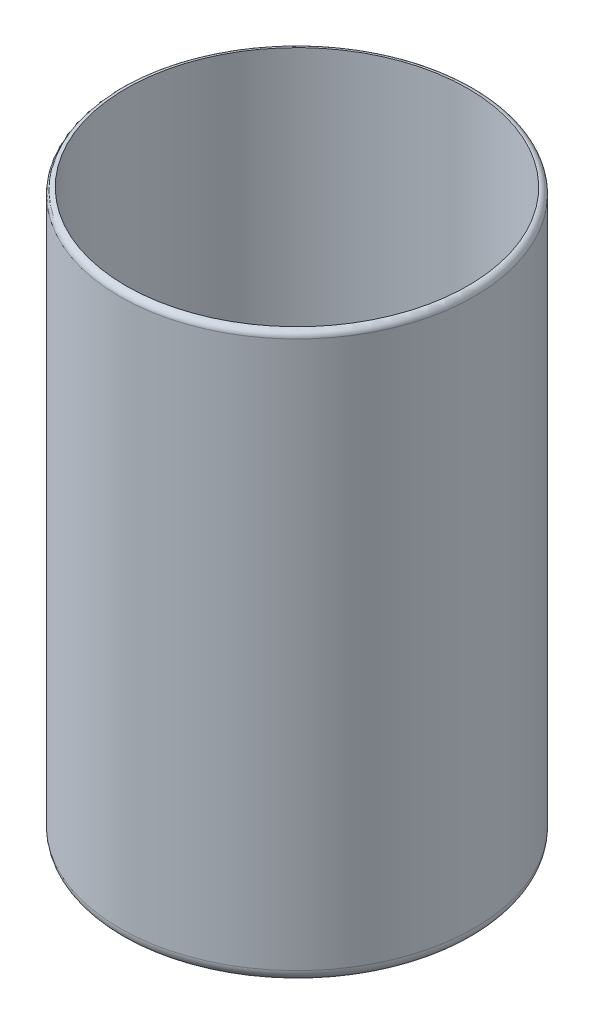
ISO-10303-21;
HEADER;
FILE_DESCRIPTION(('STEP AP214'),'2;1');
FILE_NAME('part.step','',(''),(''),'','','');
FILE_SCHEMA(('AUTOMOTIVE_DESIGN { 1 0 10303 214 1 1 1 1 }'));
ENDSEC;
DATA;
#1=APPLICATION_CONTEXT('core data for automotive mechanical design processes');
#2=APPLICATION_PROTOCOL_DEFINITION('international standard','automotive_design',2000,#1);
#3=PRODUCT_CONTEXT('',#1,'mechanical');
#4=PRODUCT('Part','Part','',(#3));
#5=PRODUCT_RELATED_PRODUCT_CATEGORY('part','',(#4));
#6=PRODUCT_DEFINITION_FORMATION('','',#4);
#7=PRODUCT_DEFINITION_CONTEXT('part definition',#1,'design');
#8=PRODUCT_DEFINITION('design','',#6,#7);
#9=PRODUCT_DEFINITION_SHAPE('','',#8);
#10=(LENGTH_UNIT() NAMED_UNIT(*) SI_UNIT(.MILLI.,.METRE.));
#11=(NAMED_UNIT(*) PLANE_ANGLE_UNIT() SI_UNIT($,.RADIAN.));
#12=(NAMED_UNIT(*) SI_UNIT($,.STERADIAN.) SOLID_ANGLE_UNIT());
#13=UNCERTAINTY_MEASURE_WITH_UNIT(LENGTH_MEASURE(1.E-05),#10,'distance_accuracy_value','');
#14=(GEOMETRIC_REPRESENTATION_CONTEXT(3) GLOBAL_UNCERTAINTY_ASSIGNED_CONTEXT((#13)) GLOBAL_UNIT_ASSIGNED_CONTEXT((#10,
#11,#12)) REPRESENTATION_CONTEXT('',''));
#15=CARTESIAN_POINT('',(0.,0.,0.));
#16=DIRECTION('',(0.,0.,1.));
#17=DIRECTION('',(1.,0.,0.));
#18=AXIS2_PLACEMENT_3D('',#15,#16,#17);
#19=CARTESIAN_POINT('',(0.,0.5,0.));
#20=DIRECTION('',(0.,-1.,0.));
#21=DIRECTION('',(0.,0.,-1.));
#22=AXIS2_PLACEMENT_3D('',#19,#20,#21);
#23=CYLINDRICAL_SURFACE('',#22,14.25);
#24=CARTESIAN_POINT('',(0.,45.,0.));
#25=DIRECTION('',(0.,1.,0.));
#26=DIRECTION('',(0.,0.,1.));
#27=AXIS2_PLACEMENT_3D('',#24,#25,#26);
#28=CIRCLE('',#27,14.25);
#29=CARTESIAN_POINT('',(0.,45.,14.25));
#30=VERTEX_POINT('',#29);
#31=EDGE_CURVE('E10',#30,#30,#28,.F.);
#32=ORIENTED_EDGE('',*,*,#31,.T.);
#33=EDGE_LOOP('',(#32));
#34=FACE_BOUND('',#33,.T.);
#35=CARTESIAN_POINT('',(0.,1.,0.));
#36=DIRECTION('',(0.,1.,0.));
#37=DIRECTION('',(0.,0.,1.));
#38=AXIS2_PLACEMENT_3D('',#35,#36,#37);
#39=CIRCLE('',#38,14.25);
#40=CARTESIAN_POINT('',(0.,1.,14.25));
#41=VERTEX_POINT('',#40);
#42=EDGE_CURVE('E44',#41,#41,#39,.T.);
#43=ORIENTED_EDGE('',*,*,#42,.T.);
#44=EDGE_LOOP('',(#43));
#45=FACE_BOUND('',#44,.T.);
#46=ADVANCED_FACE('F33',(#34,#45),#23,.T.);
#47=CARTESIAN_POINT('',(0.,0.,0.));
#48=DIRECTION('',(0.,1.,0.));
#49=DIRECTION('',(0.,0.,1.));
#50=AXIS2_PLACEMENT_3D('',#47,#48,#49);
#51=PLANE('',#50);
#52=CARTESIAN_POINT('',(0.,0.,0.));
#53=DIRECTION('',(0.,1.,0.));
#54=DIRECTION('',(0.,0.,1.));
#55=AXIS2_PLACEMENT_3D('',#52,#53,#54);
#56=CIRCLE('',#55,13.25);
#57=CARTESIAN_POINT('',(0.,0.,13.25));
#58=VERTEX_POINT('',#57);
#59=EDGE_CURVE('E40',#58,#58,#56,.F.);
#60=ORIENTED_EDGE('',*,*,#59,.T.);
#61=EDGE_LOOP('',(#60));
#62=FACE_BOUND('',#61,.T.);
#63=ADVANCED_FACE('F71',(#62),#51,.F.);
#64=CARTESIAN_POINT('',(0.,45.5,0.));
#65=DIRECTION('',(0.,-1.,0.));
#66=DIRECTION('',(0.,0.,-1.));
#67=AXIS2_PLACEMENT_3D('',#64,#65,#66);
#68=CYLINDRICAL_SURFACE('',#67,13.75);
#69=CARTESIAN_POINT('',(0.,1.5,0.));
#70=DIRECTION('',(0.,1.,0.));
#71=DIRECTION('',(0.,0.,1.));
#72=AXIS2_PLACEMENT_3D('',#69,#70,#71);
#73=CIRCLE('',#72,13.75);
#74=CARTESIAN_POINT('',(0.,1.49999999999999,-13.75));
#75=VERTEX_POINT('',#74);
#76=EDGE_CURVE('E53',#75,#75,#73,.F.);
#77=CARTESIAN_POINT('',(0.,45.5,0.));
#78=DIRECTION('',(0.,1.,0.));
#79=DIRECTION('',(0.,0.,1.));
#80=AXIS2_PLACEMENT_3D('',#77,#78,#79);
#81=CIRCLE('',#80,13.75);
#82=CARTESIAN_POINT('',(0.,45.5,-13.75));
#83=VERTEX_POINT('',#82);
#84=EDGE_CURVE('E56',#83,#83,#81,.T.);
#85=CARTESIAN_POINT('',(0.,1.49999999999999,-13.75));
#86=CARTESIAN_POINT('',(0.,1.95833333333333,-13.75));
#87=CARTESIAN_POINT('',(0.,2.41666666666666,-13.75));
#88=CARTESIAN_POINT('',(0.,3.33333333333333,-13.75));
#89=CARTESIAN_POINT('',(0.,3.79166666666666,-13.75));
#90=CARTESIAN_POINT('',(0.,4.70833333333333,-13.75));
#91=CARTESIAN_POINT('',(0.,5.16666666666666,-13.75));
#92=CARTESIAN_POINT('',(0.,6.08333333333333,-13.75));
#93=CARTESIAN_POINT('',(0.,6.54166666666666,-13.75));
#94=CARTESIAN_POINT('',(0.,7.45833333333333,-13.75));
#95=CARTESIAN_POINT('',(0.,7.91666666666666,-13.75));
#96=CARTESIAN_POINT('',(0.,8.83333333333333,-13.75));
#97=CARTESIAN_POINT('',(0.,9.29166666666666,-13.75));
#98=CARTESIAN_POINT('',(0.,10.2083333333333,-13.75));
#99=CARTESIAN_POINT('',(0.,10.6666666666667,-13.75));
#100=CARTESIAN_POINT('',(0.,11.5833333333333,-13.75));
#101=CARTESIAN_POINT('',(0.,12.0416666666667,-13.75));
#102=CARTESIAN_POINT('',(0.,12.9583333333333,-13.75));
#103=CARTESIAN_POINT('',(0.,13.4166666666667,-13.75));
#104=CARTESIAN_POINT('',(0.,14.3333333333333,-13.75));
#105=CARTESIAN_POINT('',(0.,14.7916666666667,-13.75));
#106=CARTESIAN_POINT('',(0.,15.7083333333333,-13.75));
#107=CARTESIAN_POINT('',(0.,16.1666666666667,-13.75));
#108=CARTESIAN_POINT('',(0.,17.0833333333333,-13.75));
#109=CARTESIAN_POINT('',(0.,17.5416666666667,-13.75));
#110=CARTESIAN_POINT('',(0.,18.4583333333333,-13.75));
#111=CARTESIAN_POINT('',(0.,18.9166666666667,-13.75));
#112=CARTESIAN_POINT('',(0.,19.8333333333333,-13.75));
#113=CARTESIAN_POINT('',(0.,20.2916666666667,-13.75));
#114=CARTESIAN_POINT('',(0.,21.2083333333333,-13.75));
#115=CARTESIAN_POINT('',(0.,21.6666666666667,-13.75));
#116=CARTESIAN_POINT('',(0.,22.5833333333333,-13.75));
#117=CARTESIAN_POINT('',(0.,23.0416666666667,-13.75));
#118=CARTESIAN_POINT('',(0.,23.9583333333333,-13.75));
#119=CARTESIAN_POINT('',(0.,24.4166666666667,-13.75));
#120=CARTESIAN_POINT('',(0.,25.3333333333333,-13.75));
#121=CARTESIAN_POINT('',(0.,25.7916666666667,-13.75));
#122=CARTESIAN_POINT('',(0.,26.7083333333333,-13.75));
#123=CARTESIAN_POINT('',(0.,27.1666666666667,-13.75));
#124=CARTESIAN_POINT('',(0.,28.0833333333333,-13.75));
#125=CARTESIAN_POINT('',(0.,28.5416666666667,-13.75));
#126=CARTESIAN_POINT('',(0.,29.4583333333333,-13.75));
#127=CARTESIAN_POINT('',(0.,29.9166666666667,-13.75));
#128=CARTESIAN_POINT('',(0.,30.8333333333333,-13.75));
#129=CARTESIAN_POINT('',(0.,31.2916666666667,-13.75));
#130=CARTESIAN_POINT('',(0.,32.2083333333333,-13.75));
#131=CARTESIAN_POINT('',(0.,32.6666666666667,-13.75));
#132=CARTESIAN_POINT('',(0.,33.5833333333333,-13.75));
#133=CARTESIAN_POINT('',(0.,34.0416666666667,-13.75));
#134=CARTESIAN_POINT('',(0.,34.9583333333333,-13.75));
#135=CARTESIAN_POINT('',(0.,35.4166666666667,-13.75));
#136=CARTESIAN_POINT('',(0.,36.3333333333333,-13.75));
#137=CARTESIAN_POINT('',(0.,36.7916666666667,-13.75));
#138=CARTESIAN_POINT('',(0.,37.7083333333333,-13.75));
#139=CARTESIAN_POINT('',(0.,38.1666666666667,-13.75));
#140=CARTESIAN_POINT('',(0.,39.0833333333333,-13.75));
#141=CARTESIAN_POINT('',(0.,39.5416666666667,-13.75));
#142=CARTESIAN_POINT('',(0.,40.4583333333333,-13.75));
#143=CARTESIAN_POINT('',(0.,40.9166666666667,-13.75));
#144=CARTESIAN_POINT('',(0.,41.8333333333333,-13.75));
#145=CARTESIAN_POINT('',(0.,42.2916666666667,-13.75));
#146=CARTESIAN_POINT('',(0.,43.2083333333333,-13.75));
#147=CARTESIAN_POINT('',(0.,43.6666666666667,-13.75));
#148=CARTESIAN_POINT('',(0.,44.5833333333333,-13.75));
#149=CARTESIAN_POINT('',(0.,45.0416666666667,-13.75));
#150=CARTESIAN_POINT('',(0.,45.5,-13.75));
#151=B_SPLINE_CURVE_WITH_KNOTS('',3,(#85,#86,#87,#88,#89,#90,#91,#92,#93,#94,#95,#96,#97,#98,
#99,#100,#101,#102,#103,#104,#105,#106,#107,#108,#109,#110,#111,#112,#113,#114,#115,#116,#117,
#118,#119,#120,#121,#122,#123,#124,#125,#126,#127,#128,#129,#130,#131,#132,#133,#134,#135,#136,
#137,#138,#139,#140,#141,#142,#143,#144,#145,#146,#147,#148,#149,#150),.UNSPECIFIED.,.F.,.F.,(4,
2,2,2,2,2,2,2,2,2,2,2,2,2,2,2,2,2,2,2,2,2,2,2,2,2,2,2,2,2,2,2,4),(0.,1.375,2.75,4.125,5.5,6.875,
8.25,9.625,11.,12.375,13.75,15.125,16.5,17.875,19.25,20.625,22.,23.375,24.75,26.125,27.5,28.875,
30.25,31.625,33.,34.375,35.75,37.125,38.5,39.875,41.25,42.625,44.),.UNSPECIFIED.);
#152=EDGE_CURVE('BSEAM60',#75,#83,#151,.T.);
#153=ORIENTED_EDGE('',*,*,#76,.T.);
#154=ORIENTED_EDGE('',*,*,#84,.T.);
#155=ORIENTED_EDGE('',*,*,#152,.T.);
#156=ORIENTED_EDGE('',*,*,#152,.F.);
#157=EDGE_LOOP('',(#153,#155,#154,#156));
#158=FACE_BOUND('',#157,.T.);
#159=ADVANCED_FACE('F60',(#158),#68,.F.);
#160=CARTESIAN_POINT('',(0.,0.5,0.));
#161=DIRECTION('',(0.,1.,0.));
#162=DIRECTION('',(0.,0.,1.));
#163=AXIS2_PLACEMENT_3D('',#160,#161,#162);
#164=PLANE('',#163);
#165=CARTESIAN_POINT('',(0.,0.5,0.));
#166=DIRECTION('',(0.,1.,0.));
#167=DIRECTION('',(0.,0.,1.));
#168=AXIS2_PLACEMENT_3D('',#165,#166,#167);
#169=CIRCLE('',#168,12.75);
#170=CARTESIAN_POINT('',(0.,0.5,12.75));
#171=VERTEX_POINT('',#170);
#172=EDGE_CURVE('E48',#171,#171,#169,.T.);
#173=ORIENTED_EDGE('',*,*,#172,.T.);
#174=EDGE_LOOP('',(#173));
#175=FACE_BOUND('',#174,.T.);
#176=ADVANCED_FACE('F81',(#175),#164,.T.);
#177=CARTESIAN_POINT('',(0.,1.5,0.));
#178=DIRECTION('',(0.,1.,0.));
#179=DIRECTION('',(0.,0.,1.));
#180=AXIS2_PLACEMENT_3D('',#177,#178,#179);
#181=TOROIDAL_SURFACE('',#180,12.75,1.);
#182=ORIENTED_EDGE('',*,*,#172,.F.);
#183=EDGE_LOOP('',(#182));
#184=FACE_BOUND('',#183,.T.);
#185=ORIENTED_EDGE('',*,*,#76,.F.);
#186=EDGE_LOOP('',(#185));
#187=FACE_BOUND('',#186,.T.);
#188=ADVANCED_FACE('F68',(#184,#187),#181,.F.);
#189=CARTESIAN_POINT('',(0.,1.,0.));
#190=DIRECTION('',(0.,1.,0.));
#191=DIRECTION('',(0.,0.,1.));
#192=AXIS2_PLACEMENT_3D('',#189,#190,#191);
#193=TOROIDAL_SURFACE('',#192,13.25,1.);
#194=ORIENTED_EDGE('',*,*,#59,.F.);
#195=EDGE_LOOP('',(#194));
#196=FACE_BOUND('',#195,.T.);
#197=ORIENTED_EDGE('',*,*,#42,.F.);
#198=EDGE_LOOP('',(#197));
#199=FACE_BOUND('',#198,.T.);
#200=ADVANCED_FACE('F63',(#196,#199),#193,.T.);
#201=CARTESIAN_POINT('',(0.,45.,0.));
#202=DIRECTION('',(0.,1.,0.));
#203=DIRECTION('',(0.,0.,1.));
#204=AXIS2_PLACEMENT_3D('',#201,#202,#203);
#205=TOROIDAL_SURFACE('',#204,13.75,0.5);
#206=ORIENTED_EDGE('',*,*,#31,.F.);
#207=EDGE_LOOP('',(#206));
#208=FACE_BOUND('',#207,.T.);
#209=ORIENTED_EDGE('',*,*,#84,.F.);
#210=EDGE_LOOP('',(#209));
#211=FACE_BOUND('',#210,.T.);
#212=ADVANCED_FACE('F35',(#208,#211),#205,.T.);
#213=CLOSED_SHELL('',(#46,#63,#159,#176,#188,#200,#212));
#214=MANIFOLD_SOLID_BREP('B2',#213);
#215=ADVANCED_BREP_SHAPE_REPRESENTATION('',(#18,#214),#14);
#216=SHAPE_DEFINITION_REPRESENTATION(#9,#215);
ENDSEC;
END-ISO-10303-21;
